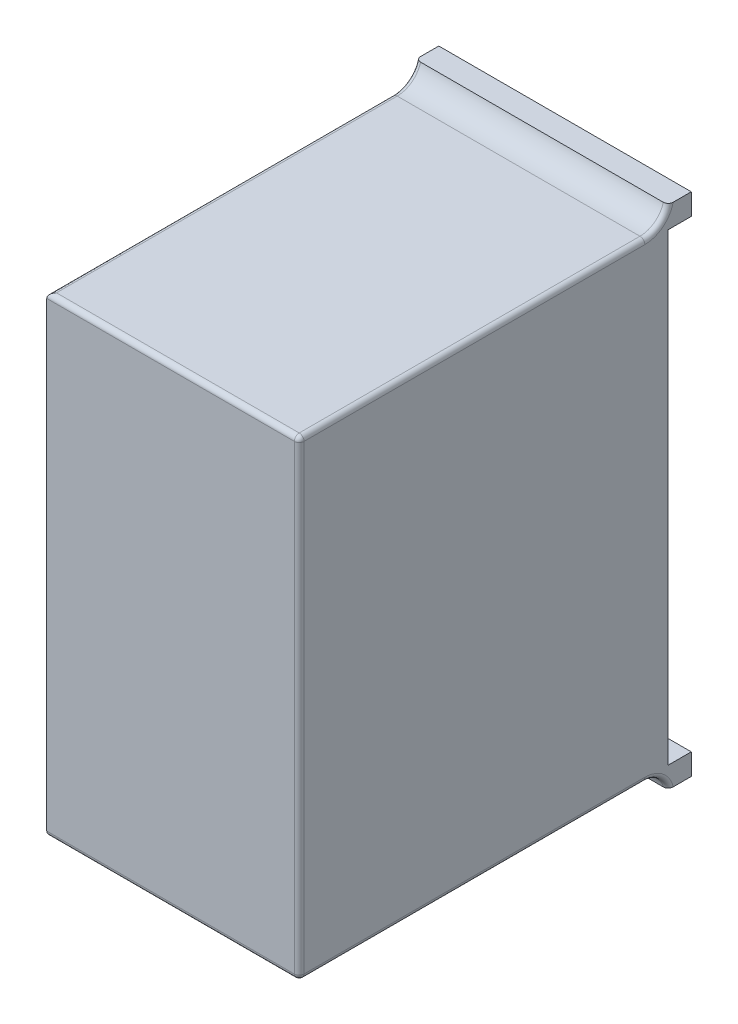
ISO-10303-21;
HEADER;
FILE_DESCRIPTION(('STEP AP214'),'2;1');
FILE_NAME('part.step','',(''),(''),'','','');
FILE_SCHEMA(('AUTOMOTIVE_DESIGN { 1 0 10303 214 1 1 1 1 }'));
ENDSEC;
DATA;
#1=APPLICATION_CONTEXT('core data for automotive mechanical design processes');
#2=APPLICATION_PROTOCOL_DEFINITION('international standard','automotive_design',2000,#1);
#3=PRODUCT_CONTEXT('',#1,'mechanical');
#4=PRODUCT('Part','Part','',(#3));
#5=PRODUCT_RELATED_PRODUCT_CATEGORY('part','',(#4));
#6=PRODUCT_DEFINITION_FORMATION('','',#4);
#7=PRODUCT_DEFINITION_CONTEXT('part definition',#1,'design');
#8=PRODUCT_DEFINITION('design','',#6,#7);
#9=PRODUCT_DEFINITION_SHAPE('','',#8);
#10=(LENGTH_UNIT() NAMED_UNIT(*) SI_UNIT(.MILLI.,.METRE.));
#11=(NAMED_UNIT(*) PLANE_ANGLE_UNIT() SI_UNIT($,.RADIAN.));
#12=(NAMED_UNIT(*) SI_UNIT($,.STERADIAN.) SOLID_ANGLE_UNIT());
#13=UNCERTAINTY_MEASURE_WITH_UNIT(LENGTH_MEASURE(1.E-05),#10,'distance_accuracy_value','');
#14=(GEOMETRIC_REPRESENTATION_CONTEXT(3) GLOBAL_UNCERTAINTY_ASSIGNED_CONTEXT((#13)) GLOBAL_UNIT_ASSIGNED_CONTEXT((#10,
#11,#12)) REPRESENTATION_CONTEXT('',''));
#15=CARTESIAN_POINT('',(0.,0.,0.));
#16=DIRECTION('',(0.,0.,1.));
#17=DIRECTION('',(1.,0.,0.));
#18=AXIS2_PLACEMENT_3D('',#15,#16,#17);
#19=CARTESIAN_POINT('',(0.,0.,0.));
#20=DIRECTION('',(1.,0.,0.));
#21=DIRECTION('',(0.,0.,-1.));
#22=AXIS2_PLACEMENT_3D('',#19,#20,#21);
#23=PLANE('',#22);
#24=DIRECTION('',(0.,0.,1.));
#25=VECTOR('',#24,1.);
#26=CARTESIAN_POINT('',(0.,-7.29999999999999,-161.5));
#27=LINE('',#26,#25);
#28=CARTESIAN_POINT('',(0.,-7.29999999999999,-161.5));
#29=VERTEX_POINT('',#28);
#30=CARTESIAN_POINT('',(0.,-7.29999999999999,-154.063701940291));
#31=VERTEX_POINT('',#30);
#32=EDGE_CURVE('E206',#29,#31,#27,.T.);
#33=ORIENTED_EDGE('',*,*,#32,.T.);
#34=CARTESIAN_POINT('',(0.,-9.99999999999998,-142.371396778348));
#35=DIRECTION('',(1.,0.,0.));
#36=DIRECTION('',(0.,0.,-1.));
#37=AXIS2_PLACEMENT_3D('',#34,#35,#36);
#38=CIRCLE('',#37,12.);
#39=CARTESIAN_POINT('',(0.,1.49999999999998,-145.799224078549));
#40=VERTEX_POINT('',#39);
#41=EDGE_CURVE('E517',#31,#40,#38,.T.);
#42=ORIENTED_EDGE('',*,*,#41,.T.);
#43=DIRECTION('',(0.,0.,1.));
#44=VECTOR('',#43,1.);
#45=CARTESIAN_POINT('',(0.,1.49999999999998,-152.));
#46=LINE('',#45,#44);
#47=CARTESIAN_POINT('',(0.,1.50000000000001,-161.5));
#48=VERTEX_POINT('',#47);
#49=EDGE_CURVE('E229',#48,#40,#46,.T.);
#50=ORIENTED_EDGE('',*,*,#49,.F.);
#51=DIRECTION('',(0.,1.,0.));
#52=VECTOR('',#51,1.);
#53=CARTESIAN_POINT('',(0.,1.50000000000001,-161.5));
#54=LINE('',#53,#52);
#55=EDGE_CURVE('E210',#29,#48,#54,.T.);
#56=ORIENTED_EDGE('',*,*,#55,.F.);
#57=EDGE_LOOP('',(#33,#42,#50,#56));
#58=FACE_BOUND('',#57,.T.);
#59=ADVANCED_FACE('F45',(#58),#23,.F.);
#60=DIRECTION('',(0.,0.,-1.));
#61=VECTOR('',#60,1.);
#62=CARTESIAN_POINT('',(0.,192.5,-1.5));
#63=LINE('',#62,#61);
#64=CARTESIAN_POINT('',(0.,192.5,-145.799224078549));
#65=VERTEX_POINT('',#64);
#66=CARTESIAN_POINT('',(0.,192.5,-161.5));
#67=VERTEX_POINT('',#66);
#68=EDGE_CURVE('E262',#65,#67,#63,.T.);
#69=ORIENTED_EDGE('',*,*,#68,.F.);
#70=CARTESIAN_POINT('',(0.,204.,-142.371396778348));
#71=DIRECTION('',(1.,0.,0.));
#72=DIRECTION('',(0.,0.,-1.));
#73=AXIS2_PLACEMENT_3D('',#70,#71,#72);
#74=CIRCLE('',#73,12.);
#75=CARTESIAN_POINT('',(0.,201.3,-154.063701940291));
#76=VERTEX_POINT('',#75);
#77=EDGE_CURVE('E417',#65,#76,#74,.T.);
#78=ORIENTED_EDGE('',*,*,#77,.T.);
#79=DIRECTION('',(0.,0.,1.));
#80=VECTOR('',#79,1.);
#81=CARTESIAN_POINT('',(0.,201.3,-161.5));
#82=LINE('',#81,#80);
#83=CARTESIAN_POINT('',(0.,201.3,-161.5));
#84=VERTEX_POINT('',#83);
#85=EDGE_CURVE('E235',#84,#76,#82,.T.);
#86=ORIENTED_EDGE('',*,*,#85,.F.);
#87=DIRECTION('',(0.,1.,0.));
#88=VECTOR('',#87,1.);
#89=CARTESIAN_POINT('',(0.,192.5,-161.5));
#90=LINE('',#89,#88);
#91=EDGE_CURVE('E249',#67,#84,#90,.T.);
#92=ORIENTED_EDGE('',*,*,#91,.F.);
#93=EDGE_LOOP('',(#69,#78,#86,#92));
#94=FACE_BOUND('',#93,.T.);
#95=ADVANCED_FACE('F448',(#94),#23,.F.);
#96=CARTESIAN_POINT('',(104.,0.,-152.));
#97=DIRECTION('',(0.,0.,1.));
#98=DIRECTION('',(1.,0.,0.));
#99=AXIS2_PLACEMENT_3D('',#96,#97,#98);
#100=PLANE('',#99);
#101=DIRECTION('',(1.,0.,0.));
#102=VECTOR('',#101,1.);
#103=CARTESIAN_POINT('',(104.,1.5,-152.));
#104=LINE('',#103,#102);
#105=CARTESIAN_POINT('',(102.5,1.50000000000002,-152.));
#106=VERTEX_POINT('',#105);
#107=CARTESIAN_POINT('',(104.,1.5,-152.));
#108=VERTEX_POINT('',#107);
#109=EDGE_CURVE('E284',#106,#108,#104,.T.);
#110=ORIENTED_EDGE('',*,*,#109,.F.);
#111=DIRECTION('',(0.,1.,0.));
#112=VECTOR('',#111,1.);
#113=CARTESIAN_POINT('',(102.5,0.,-152.));
#114=LINE('',#113,#112);
#115=CARTESIAN_POINT('',(102.5,192.5,-152.));
#116=VERTEX_POINT('',#115);
#117=EDGE_CURVE('E267',#106,#116,#114,.T.);
#118=ORIENTED_EDGE('',*,*,#117,.T.);
#119=DIRECTION('',(-1.,0.,0.));
#120=VECTOR('',#119,1.);
#121=CARTESIAN_POINT('',(0.,192.5,-152.));
#122=LINE('',#121,#120);
#123=CARTESIAN_POINT('',(104.,192.5,-152.));
#124=VERTEX_POINT('',#123);
#125=EDGE_CURVE('E245',#124,#116,#122,.T.);
#126=ORIENTED_EDGE('',*,*,#125,.F.);
#127=DIRECTION('',(0.,1.,0.));
#128=VECTOR('',#127,1.);
#129=CARTESIAN_POINT('',(104.,0.,-152.));
#130=LINE('',#129,#128);
#131=EDGE_CURVE('E281',#108,#124,#130,.T.);
#132=ORIENTED_EDGE('',*,*,#131,.F.);
#133=EDGE_LOOP('',(#110,#118,#126,#132));
#134=FACE_BOUND('',#133,.T.);
#135=ADVANCED_FACE('F456',(#134),#100,.F.);
#136=CARTESIAN_POINT('',(104.,0.,0.));
#137=DIRECTION('',(0.,1.,0.));
#138=DIRECTION('',(0.,0.,1.));
#139=AXIS2_PLACEMENT_3D('',#136,#137,#138);
#140=PLANE('',#139);
#141=DIRECTION('',(1.,0.,0.));
#142=VECTOR('',#141,1.);
#143=CARTESIAN_POINT('',(104.,0.,-142.371396778348));
#144=LINE('',#143,#142);
#145=CARTESIAN_POINT('',(2.,0.,-142.371396778348));
#146=VERTEX_POINT('',#145);
#147=CARTESIAN_POINT('',(102.,0.,-142.371396778348));
#148=VERTEX_POINT('',#147);
#149=EDGE_CURVE('E287',#146,#148,#144,.T.);
#150=ORIENTED_EDGE('',*,*,#149,.T.);
#151=DIRECTION('',(0.,0.,-1.));
#152=VECTOR('',#151,1.);
#153=CARTESIAN_POINT('',(102.,0.,0.));
#154=LINE('',#153,#152);
#155=CARTESIAN_POINT('',(102.,0.,-2.));
#156=VERTEX_POINT('',#155);
#157=EDGE_CURVE('E356',#148,#156,#154,.F.);
#158=ORIENTED_EDGE('',*,*,#157,.T.);
#159=DIRECTION('',(-1.,0.,0.));
#160=VECTOR('',#159,1.);
#161=CARTESIAN_POINT('',(104.,0.,-2.));
#162=LINE('',#161,#160);
#163=CARTESIAN_POINT('',(2.,0.,-2.));
#164=VERTEX_POINT('',#163);
#165=EDGE_CURVE('E354',#156,#164,#162,.T.);
#166=ORIENTED_EDGE('',*,*,#165,.T.);
#167=DIRECTION('',(0.,0.,-1.));
#168=VECTOR('',#167,1.);
#169=CARTESIAN_POINT('',(2.,0.,0.));
#170=LINE('',#169,#168);
#171=EDGE_CURVE('E352',#164,#146,#170,.T.);
#172=ORIENTED_EDGE('',*,*,#171,.T.);
#173=EDGE_LOOP('',(#150,#158,#166,#172));
#174=FACE_BOUND('',#173,.T.);
#175=ADVANCED_FACE('F455',(#174),#140,.F.);
#176=CARTESIAN_POINT('',(104.,194.,0.));
#177=DIRECTION('',(0.,-1.,0.));
#178=DIRECTION('',(0.,0.,-1.));
#179=AXIS2_PLACEMENT_3D('',#176,#177,#178);
#180=PLANE('',#179);
#181=DIRECTION('',(-1.,0.,0.));
#182=VECTOR('',#181,1.);
#183=CARTESIAN_POINT('',(104.,194.,-142.371396778348));
#184=LINE('',#183,#182);
#185=CARTESIAN_POINT('',(102.,194.,-142.371396778348));
#186=VERTEX_POINT('',#185);
#187=CARTESIAN_POINT('',(2.,194.,-142.371396778348));
#188=VERTEX_POINT('',#187);
#189=EDGE_CURVE('E290',#186,#188,#184,.T.);
#190=ORIENTED_EDGE('',*,*,#189,.T.);
#191=DIRECTION('',(0.,0.,1.));
#192=VECTOR('',#191,1.);
#193=CARTESIAN_POINT('',(2.,194.,0.));
#194=LINE('',#193,#192);
#195=CARTESIAN_POINT('',(2.,194.,-2.));
#196=VERTEX_POINT('',#195);
#197=EDGE_CURVE('E11',#188,#196,#194,.T.);
#198=ORIENTED_EDGE('',*,*,#197,.T.);
#199=DIRECTION('',(-1.,0.,0.));
#200=VECTOR('',#199,1.);
#201=CARTESIAN_POINT('',(104.,194.,-2.));
#202=LINE('',#201,#200);
#203=CARTESIAN_POINT('',(102.,194.,-2.));
#204=VERTEX_POINT('',#203);
#205=EDGE_CURVE('E55',#196,#204,#202,.F.);
#206=ORIENTED_EDGE('',*,*,#205,.T.);
#207=DIRECTION('',(0.,0.,1.));
#208=VECTOR('',#207,1.);
#209=CARTESIAN_POINT('',(102.,194.,-142.371396778348));
#210=LINE('',#209,#208);
#211=EDGE_CURVE('E368',#204,#186,#210,.F.);
#212=ORIENTED_EDGE('',*,*,#211,.T.);
#213=EDGE_LOOP('',(#190,#198,#206,#212));
#214=FACE_BOUND('',#213,.T.);
#215=ADVANCED_FACE('F451',(#214),#180,.F.);
#216=CARTESIAN_POINT('',(104.,0.,0.));
#217=DIRECTION('',(0.,0.,-1.));
#218=DIRECTION('',(-1.,0.,0.));
#219=AXIS2_PLACEMENT_3D('',#216,#217,#218);
#220=PLANE('',#219);
#221=DIRECTION('',(0.,-1.,0.));
#222=VECTOR('',#221,1.);
#223=CARTESIAN_POINT('',(0.,0.,0.));
#224=LINE('',#223,#222);
#225=CARTESIAN_POINT('',(0.,192.,0.));
#226=VERTEX_POINT('',#225);
#227=CARTESIAN_POINT('',(0.,2.,0.));
#228=VERTEX_POINT('',#227);
#229=EDGE_CURVE('E277',#226,#228,#224,.T.);
#230=ORIENTED_EDGE('',*,*,#229,.T.);
#231=DIRECTION('',(-1.,0.,0.));
#232=VECTOR('',#231,1.);
#233=CARTESIAN_POINT('',(104.,2.,0.));
#234=LINE('',#233,#232);
#235=CARTESIAN_POINT('',(102.,2.,0.));
#236=VERTEX_POINT('',#235);
#237=EDGE_CURVE('E362',#228,#236,#234,.F.);
#238=ORIENTED_EDGE('',*,*,#237,.T.);
#239=DIRECTION('',(0.,-1.,0.));
#240=VECTOR('',#239,1.);
#241=CARTESIAN_POINT('',(102.,194.,0.));
#242=LINE('',#241,#240);
#243=CARTESIAN_POINT('',(102.,192.,0.));
#244=VERTEX_POINT('',#243);
#245=EDGE_CURVE('E360',#236,#244,#242,.F.);
#246=ORIENTED_EDGE('',*,*,#245,.T.);
#247=DIRECTION('',(-1.,0.,0.));
#248=VECTOR('',#247,1.);
#249=CARTESIAN_POINT('',(104.,192.,0.));
#250=LINE('',#249,#248);
#251=EDGE_CURVE('E358',#244,#226,#250,.T.);
#252=ORIENTED_EDGE('',*,*,#251,.T.);
#253=EDGE_LOOP('',(#230,#238,#246,#252));
#254=FACE_BOUND('',#253,.T.);
#255=ADVANCED_FACE('F444',(#254),#220,.F.);
#256=CARTESIAN_POINT('',(104.,0.,0.));
#257=DIRECTION('',(1.,0.,0.));
#258=DIRECTION('',(0.,0.,-1.));
#259=AXIS2_PLACEMENT_3D('',#256,#257,#258);
#260=PLANE('',#259);
#261=DIRECTION('',(0.,0.,-1.));
#262=VECTOR('',#261,1.);
#263=CARTESIAN_POINT('',(104.,2.00000000000002,-142.371396778348));
#264=LINE('',#263,#262);
#265=CARTESIAN_POINT('',(104.,2.,-2.));
#266=VERTEX_POINT('',#265);
#267=CARTESIAN_POINT('',(104.,2.00000000000002,-142.371396778348));
#268=VERTEX_POINT('',#267);
#269=EDGE_CURVE('E296',#266,#268,#264,.T.);
#270=ORIENTED_EDGE('',*,*,#269,.T.);
#271=CARTESIAN_POINT('',(104.,-9.99999999999999,-142.371396778348));
#272=DIRECTION('',(1.,0.,0.));
#273=DIRECTION('',(0.,0.,-1.));
#274=AXIS2_PLACEMENT_3D('',#271,#272,#273);
#275=CIRCLE('',#274,12.);
#276=CARTESIAN_POINT('',(104.,-7.3,-154.063701940291));
#277=VERTEX_POINT('',#276);
#278=EDGE_CURVE('E225',#268,#277,#275,.F.);
#279=ORIENTED_EDGE('',*,*,#278,.T.);
#280=DIRECTION('',(0.,0.,1.));
#281=VECTOR('',#280,1.);
#282=CARTESIAN_POINT('',(104.,-7.3,-161.5));
#283=LINE('',#282,#281);
#284=CARTESIAN_POINT('',(104.,-7.3,-161.5));
#285=VERTEX_POINT('',#284);
#286=EDGE_CURVE('E204',#285,#277,#283,.T.);
#287=ORIENTED_EDGE('',*,*,#286,.F.);
#288=DIRECTION('',(0.,-1.,0.));
#289=VECTOR('',#288,1.);
#290=CARTESIAN_POINT('',(104.,1.5,-161.5));
#291=LINE('',#290,#289);
#292=CARTESIAN_POINT('',(104.,1.5,-161.5));
#293=VERTEX_POINT('',#292);
#294=EDGE_CURVE('E211',#293,#285,#291,.T.);
#295=ORIENTED_EDGE('',*,*,#294,.F.);
#296=DIRECTION('',(0.,0.,1.));
#297=VECTOR('',#296,1.);
#298=CARTESIAN_POINT('',(104.,1.5,-161.5));
#299=LINE('',#298,#297);
#300=EDGE_CURVE('E231',#293,#108,#299,.T.);
#301=ORIENTED_EDGE('',*,*,#300,.T.);
#302=ORIENTED_EDGE('',*,*,#131,.T.);
#303=DIRECTION('',(0.,0.,1.));
#304=VECTOR('',#303,1.);
#305=CARTESIAN_POINT('',(104.,192.5,-161.5));
#306=LINE('',#305,#304);
#307=CARTESIAN_POINT('',(104.,192.5,-161.5));
#308=VERTEX_POINT('',#307);
#309=EDGE_CURVE('E241',#308,#124,#306,.T.);
#310=ORIENTED_EDGE('',*,*,#309,.F.);
#311=DIRECTION('',(0.,-1.,0.));
#312=VECTOR('',#311,1.);
#313=CARTESIAN_POINT('',(104.,192.5,-161.5));
#314=LINE('',#313,#312);
#315=CARTESIAN_POINT('',(104.,201.3,-161.5));
#316=VERTEX_POINT('',#315);
#317=EDGE_CURVE('E254',#316,#308,#314,.T.);
#318=ORIENTED_EDGE('',*,*,#317,.F.);
#319=DIRECTION('',(0.,0.,1.));
#320=VECTOR('',#319,1.);
#321=CARTESIAN_POINT('',(104.,201.3,-161.5));
#322=LINE('',#321,#320);
#323=CARTESIAN_POINT('',(104.,201.3,-154.063701940291));
#324=VERTEX_POINT('',#323);
#325=EDGE_CURVE('E238',#316,#324,#322,.T.);
#326=ORIENTED_EDGE('',*,*,#325,.T.);
#327=CARTESIAN_POINT('',(104.,204.,-142.371396778348));
#328=DIRECTION('',(1.,0.,0.));
#329=DIRECTION('',(0.,0.,-1.));
#330=AXIS2_PLACEMENT_3D('',#327,#328,#329);
#331=CIRCLE('',#330,12.);
#332=CARTESIAN_POINT('',(104.,192.,-142.371396778348));
#333=VERTEX_POINT('',#332);
#334=EDGE_CURVE('E298',#324,#333,#331,.F.);
#335=ORIENTED_EDGE('',*,*,#334,.T.);
#336=DIRECTION('',(0.,0.,1.));
#337=VECTOR('',#336,1.);
#338=CARTESIAN_POINT('',(104.,192.,0.));
#339=LINE('',#338,#337);
#340=CARTESIAN_POINT('',(104.,192.,-2.));
#341=VERTEX_POINT('',#340);
#342=EDGE_CURVE('E292',#333,#341,#339,.T.);
#343=ORIENTED_EDGE('',*,*,#342,.T.);
#344=DIRECTION('',(0.,-1.,0.));
#345=VECTOR('',#344,1.);
#346=CARTESIAN_POINT('',(104.,0.,-2.));
#347=LINE('',#346,#345);
#348=EDGE_CURVE('E294',#341,#266,#347,.T.);
#349=ORIENTED_EDGE('',*,*,#348,.T.);
#350=EDGE_LOOP('',(#270,#279,#287,#295,#301,#302,#310,#318,#326,#335,#343,#349));
#351=FACE_BOUND('',#350,.T.);
#352=ADVANCED_FACE('F223',(#351),#260,.T.);
#353=DIRECTION('',(0.,-1.,0.));
#354=VECTOR('',#353,1.);
#355=CARTESIAN_POINT('',(0.,192.5,-1.5));
#356=LINE('',#355,#354);
#357=CARTESIAN_POINT('',(0.,192.,-1.5));
#358=VERTEX_POINT('',#357);
#359=CARTESIAN_POINT('',(0.,2.,-1.5));
#360=VERTEX_POINT('',#359);
#361=EDGE_CURVE('E226',#358,#360,#356,.T.);
#362=ORIENTED_EDGE('',*,*,#361,.T.);
#363=DIRECTION('',(0.,0.,-1.));
#364=VECTOR('',#363,1.);
#365=CARTESIAN_POINT('',(0.,2.,0.));
#366=LINE('',#365,#364);
#367=EDGE_CURVE('E525',#360,#228,#366,.F.);
#368=ORIENTED_EDGE('',*,*,#367,.T.);
#369=ORIENTED_EDGE('',*,*,#229,.F.);
#370=DIRECTION('',(0.,0.,1.));
#371=VECTOR('',#370,1.);
#372=CARTESIAN_POINT('',(0.,192.,0.));
#373=LINE('',#372,#371);
#374=EDGE_CURVE('E543',#226,#358,#373,.F.);
#375=ORIENTED_EDGE('',*,*,#374,.T.);
#376=EDGE_LOOP('',(#362,#368,#369,#375));
#377=FACE_BOUND('',#376,.T.);
#378=ADVANCED_FACE('F443',(#377),#23,.F.);
#379=CARTESIAN_POINT('',(104.,1.5,0.));
#380=DIRECTION('',(0.,1.,0.));
#381=DIRECTION('',(0.,0.,1.));
#382=AXIS2_PLACEMENT_3D('',#379,#380,#381);
#383=PLANE('',#382);
#384=ORIENTED_EDGE('',*,*,#49,.T.);
#385=CARTESIAN_POINT('',(0.,1.50000000000002,-145.799224078549));
#386=CARTESIAN_POINT('',(2.69196557595979E-05,1.50000000000002,-145.632511004218));
#387=CARTESIAN_POINT('',(0.00170136117057736,1.50000000000002,-145.465816021866));
#388=CARTESIAN_POINT('',(0.00717529070023196,1.50000000000002,-145.132474692508));
#389=CARTESIAN_POINT('',(0.01097457189588,1.50000000000002,-144.965828342348));
#390=CARTESIAN_POINT('',(0.0195281880106672,1.50000000000002,-144.632582052626));
#391=CARTESIAN_POINT('',(0.0242824210350084,1.50000000000002,-144.46598211001));
#392=CARTESIAN_POINT('',(0.0337710533514081,1.50000000000002,-144.132777112914));
#393=CARTESIAN_POINT('',(0.0385054521747748,1.50000000000002,-143.966172058407));
#394=CARTESIAN_POINT('',(0.0471441613034231,1.50000000000002,-143.632903805369));
#395=CARTESIAN_POINT('',(0.0510482944028582,1.50000000000002,-143.466240602014));
#396=CARTESIAN_POINT('',(0.0574239269692432,1.50000000000002,-143.132888931277));
#397=CARTESIAN_POINT('',(0.0598954565262315,1.50000000000002,-142.966200464498));
#398=CARTESIAN_POINT('',(0.0630426938938279,1.50000000000002,-142.632799103484));
#399=CARTESIAN_POINT('',(0.0637183338283798,1.50000000000002,-142.466086208564));
#400=CARTESIAN_POINT('',(0.0633159908884878,1.50000000000002,-142.216014471722));
#401=CARTESIAN_POINT('',(0.0629458720826526,1.50000000000002,-142.132653938899));
#402=CARTESIAN_POINT('',(0.0617530423723774,1.50000000000002,-141.965936077929));
#403=CARTESIAN_POINT('',(0.0609303313812017,1.50000000000002,-141.882578749782));
#404=CARTESIAN_POINT('',(0.059891026621272,1.50000000000002,-141.799224078549));
#405=B_SPLINE_CURVE_WITH_KNOTS('',3,(#385,#386,#387,#388,#389,#390,#391,#392,#393,#394,#395,
#396,#397,#398,#399,#400,#401,#402,#403,#404),.UNSPECIFIED.,.F.,.F.,(4,2,2,2,2,2,2,2,2,4),(0.,
0.500106527819296,1.00016438672912,1.50016891702935,2.00018519677633,2.50030808947395,
3.00042047733759,3.50055176679382,3.75063474076187,4.00071776265634),.UNSPECIFIED.);
#406=CARTESIAN_POINT('',(0.0635083268962936,1.50000000000002,-142.371396778348));
#407=VERTEX_POINT('',#406);
#408=EDGE_CURVE('E420',#40,#407,#405,.T.);
#409=ORIENTED_EDGE('',*,*,#408,.T.);
#410=DIRECTION('',(0.,0.,-1.));
#411=VECTOR('',#410,1.);
#412=CARTESIAN_POINT('',(0.0635083268962936,1.5,0.));
#413=LINE('',#412,#411);
#414=CARTESIAN_POINT('',(0.0635083268962933,1.5,-1.5));
#415=VERTEX_POINT('',#414);
#416=EDGE_CURVE('E522',#407,#415,#413,.F.);
#417=ORIENTED_EDGE('',*,*,#416,.T.);
#418=DIRECTION('',(-1.,0.,0.));
#419=VECTOR('',#418,1.);
#420=CARTESIAN_POINT('',(104.,1.5,-1.5));
#421=LINE('',#420,#419);
#422=CARTESIAN_POINT('',(102.5,1.5,-1.5));
#423=VERTEX_POINT('',#422);
#424=EDGE_CURVE('E268',#423,#415,#421,.T.);
#425=ORIENTED_EDGE('',*,*,#424,.F.);
#426=DIRECTION('',(0.,0.,-1.));
#427=VECTOR('',#426,1.);
#428=CARTESIAN_POINT('',(102.5,1.5,0.));
#429=LINE('',#428,#427);
#430=EDGE_CURVE('E264',#423,#106,#429,.T.);
#431=ORIENTED_EDGE('',*,*,#430,.T.);
#432=ORIENTED_EDGE('',*,*,#109,.T.);
#433=ORIENTED_EDGE('',*,*,#300,.F.);
#434=DIRECTION('',(1.,0.,0.));
#435=VECTOR('',#434,1.);
#436=CARTESIAN_POINT('',(104.,1.5,-161.5));
#437=LINE('',#436,#435);
#438=EDGE_CURVE('E216',#48,#293,#437,.T.);
#439=ORIENTED_EDGE('',*,*,#438,.F.);
#440=EDGE_LOOP('',(#384,#409,#417,#425,#431,#432,#433,#439));
#441=FACE_BOUND('',#440,.T.);
#442=ADVANCED_FACE('F433',(#441),#383,.T.);
#443=CARTESIAN_POINT('',(104.,192.5,0.));
#444=DIRECTION('',(0.,-1.,0.));
#445=DIRECTION('',(0.,0.,-1.));
#446=AXIS2_PLACEMENT_3D('',#443,#444,#445);
#447=PLANE('',#446);
#448=DIRECTION('',(0.,0.,1.));
#449=VECTOR('',#448,1.);
#450=CARTESIAN_POINT('',(0.0635083268962938,192.5,0.));
#451=LINE('',#450,#449);
#452=CARTESIAN_POINT('',(0.0635083268962916,192.5,-1.5));
#453=VERTEX_POINT('',#452);
#454=CARTESIAN_POINT('',(0.0635083268962938,192.5,-142.371396778348));
#455=VERTEX_POINT('',#454);
#456=EDGE_CURVE('E410',#453,#455,#451,.F.);
#457=ORIENTED_EDGE('',*,*,#456,.T.);
#458=CARTESIAN_POINT('',(0.0635083268962888,192.5,-142.371396778348));
#459=CARTESIAN_POINT('',(0.0635553732142154,192.5,-142.538094087619));
#460=CARTESIAN_POINT('',(0.0625737404875256,192.5,-142.704787846968));
#461=CARTESIAN_POINT('',(0.0588960050049496,192.5,-143.038139324312));
#462=CARTESIAN_POINT('',(0.0562000844339027,192.5,-143.204797044254));
#463=CARTESIAN_POINT('',(0.0494366571152717,192.5,-143.538076453718));
#464=CARTESIAN_POINT('',(0.0453692036877792,192.5,-143.704698144388));
#465=CARTESIAN_POINT('',(0.0365111118425034,192.5,-144.037929311299));
#466=CARTESIAN_POINT('',(0.0317204381493339,192.5,-144.204538786546));
#467=CARTESIAN_POINT('',(0.0222462823602316,192.5,-144.537790240317));
#468=CARTESIAN_POINT('',(0.0175628190433473,192.5,-144.704432219456));
#469=CARTESIAN_POINT('',(0.00931540111614282,192.5,-145.037732098291));
#470=CARTESIAN_POINT('',(0.00575135888123907,192.5,-145.204389995718));
#471=CARTESIAN_POINT('',(0.000891566623748423,192.5,-145.53776391697));
#472=CARTESIAN_POINT('',(-0.00040397426046415,192.5,-145.704479944736));
#473=CARTESIAN_POINT('',(0.000619495680994599,192.5,-146.037942034435));
#474=CARTESIAN_POINT('',(0.00293950380759096,192.5,-146.204688091964));
#475=CARTESIAN_POINT('',(0.00774100949146482,192.5,-146.371396778348));
#476=B_SPLINE_CURVE_WITH_KNOTS('',3,(#458,#459,#460,#461,#462,#463,#464,#465,#466,#467,#468,
#469,#470,#471,#472,#473,#474,#475),.UNSPECIFIED.,.F.,.F.,(4,2,2,2,2,2,2,2,4),(0.,
0.500083354327208,1.0001135714974,1.50012435159497,2.00015952782232,2.5002816305577,
3.00036457562529,3.50049362206666,4.00076064684789),.UNSPECIFIED.);
#477=EDGE_CURVE('E416',#455,#65,#476,.T.);
#478=ORIENTED_EDGE('',*,*,#477,.T.);
#479=ORIENTED_EDGE('',*,*,#68,.T.);
#480=DIRECTION('',(-1.,0.,0.));
#481=VECTOR('',#480,1.);
#482=CARTESIAN_POINT('',(0.,192.5,-161.5));
#483=LINE('',#482,#481);
#484=EDGE_CURVE('E244',#308,#67,#483,.T.);
#485=ORIENTED_EDGE('',*,*,#484,.F.);
#486=ORIENTED_EDGE('',*,*,#309,.T.);
#487=ORIENTED_EDGE('',*,*,#125,.T.);
#488=DIRECTION('',(0.,0.,1.));
#489=VECTOR('',#488,1.);
#490=CARTESIAN_POINT('',(102.5,192.5,0.));
#491=LINE('',#490,#489);
#492=CARTESIAN_POINT('',(102.5,192.5,-1.5));
#493=VERTEX_POINT('',#492);
#494=EDGE_CURVE('E274',#116,#493,#491,.T.);
#495=ORIENTED_EDGE('',*,*,#494,.T.);
#496=DIRECTION('',(-1.,0.,0.));
#497=VECTOR('',#496,1.);
#498=CARTESIAN_POINT('',(104.,192.5,-1.5));
#499=LINE('',#498,#497);
#500=EDGE_CURVE('E271',#493,#453,#499,.T.);
#501=ORIENTED_EDGE('',*,*,#500,.T.);
#502=EDGE_LOOP('',(#457,#478,#479,#485,#486,#487,#495,#501));
#503=FACE_BOUND('',#502,.T.);
#504=ADVANCED_FACE('F428',(#503),#447,.T.);
#505=CARTESIAN_POINT('',(104.,0.,-1.5));
#506=DIRECTION('',(0.,0.,-1.));
#507=DIRECTION('',(-1.,0.,0.));
#508=AXIS2_PLACEMENT_3D('',#505,#506,#507);
#509=PLANE('',#508);
#510=ORIENTED_EDGE('',*,*,#424,.T.);
#511=CARTESIAN_POINT('',(2.,2.,-1.5));
#512=DIRECTION('',(0.,0.,-1.));
#513=DIRECTION('',(-1.,0.,0.));
#514=AXIS2_PLACEMENT_3D('',#511,#512,#513);
#515=CIRCLE('',#514,2.);
#516=EDGE_CURVE('E366',#415,#360,#515,.T.);
#517=ORIENTED_EDGE('',*,*,#516,.T.);
#518=ORIENTED_EDGE('',*,*,#361,.F.);
#519=CARTESIAN_POINT('',(2.,192.,-1.5));
#520=DIRECTION('',(0.,0.,-1.));
#521=DIRECTION('',(-1.,0.,0.));
#522=AXIS2_PLACEMENT_3D('',#519,#520,#521);
#523=CIRCLE('',#522,2.);
#524=EDGE_CURVE('E364',#358,#453,#523,.T.);
#525=ORIENTED_EDGE('',*,*,#524,.T.);
#526=ORIENTED_EDGE('',*,*,#500,.F.);
#527=DIRECTION('',(0.,-1.,0.));
#528=VECTOR('',#527,1.);
#529=CARTESIAN_POINT('',(102.5,0.,-1.5));
#530=LINE('',#529,#528);
#531=EDGE_CURVE('E272',#493,#423,#530,.T.);
#532=ORIENTED_EDGE('',*,*,#531,.T.);
#533=EDGE_LOOP('',(#510,#517,#518,#525,#526,#532));
#534=FACE_BOUND('',#533,.T.);
#535=ADVANCED_FACE('F432',(#534),#509,.T.);
#536=CARTESIAN_POINT('',(102.5,0.,0.));
#537=DIRECTION('',(1.,0.,0.));
#538=DIRECTION('',(0.,0.,-1.));
#539=AXIS2_PLACEMENT_3D('',#536,#537,#538);
#540=PLANE('',#539);
#541=ORIENTED_EDGE('',*,*,#430,.F.);
#542=ORIENTED_EDGE('',*,*,#531,.F.);
#543=ORIENTED_EDGE('',*,*,#494,.F.);
#544=ORIENTED_EDGE('',*,*,#117,.F.);
#545=EDGE_LOOP('',(#541,#542,#543,#544));
#546=FACE_BOUND('',#545,.T.);
#547=ADVANCED_FACE('F330',(#546),#540,.F.);
#548=CARTESIAN_POINT('',(0.,201.3,-161.5));
#549=DIRECTION('',(0.,-1.,0.));
#550=DIRECTION('',(0.,0.,-1.));
#551=AXIS2_PLACEMENT_3D('',#548,#549,#550);
#552=PLANE('',#551);
#553=ORIENTED_EDGE('',*,*,#85,.T.);
#554=CARTESIAN_POINT('',(0.,201.3,-154.063701940291));
#555=CARTESIAN_POINT('',(1.11902517823443E-06,201.3,-154.004442905563));
#556=CARTESIAN_POINT('',(0.00250183234931162,201.3,-153.945212832386));
#557=CARTESIAN_POINT('',(0.0124715391607993,201.3,-153.827174616716));
#558=CARTESIAN_POINT('',(0.0199403401494625,201.3,-153.768366457964));
#559=CARTESIAN_POINT('',(0.0497313139473504,201.3,-153.593240269779));
#560=CARTESIAN_POINT('',(0.0794382048310986,201.3,-153.478090797808));
#561=CARTESIAN_POINT('',(0.157764150767018,201.3,-153.254405705909));
#562=CARTESIAN_POINT('',(0.206393222657763,201.3,-153.145873624288));
#563=CARTESIAN_POINT('',(0.321312452709275,201.3,-152.938605573222));
#564=CARTESIAN_POINT('',(0.387597758943651,201.3,-152.839866922762));
#565=CARTESIAN_POINT('',(0.535520396391735,201.3,-152.655949641572));
#566=CARTESIAN_POINT('',(0.617029926105599,201.3,-152.570668307885));
#567=CARTESIAN_POINT('',(0.793605126150239,201.3,-152.415463124491));
#568=CARTESIAN_POINT('',(0.888672115223417,201.3,-152.345540770443));
#569=CARTESIAN_POINT('',(1.08679758348643,201.3,-152.22525631119));
#570=CARTESIAN_POINT('',(1.18955545276339,201.3,-152.174398622852));
#571=CARTESIAN_POINT('',(1.40231625831917,201.3,-152.091393942028));
#572=CARTESIAN_POINT('',(1.5123108750009,201.3,-152.059225867765));
#573=CARTESIAN_POINT('',(1.6860699211763,201.3,-152.024698537906));
#574=CARTESIAN_POINT('',(1.74853841756046,201.3,-152.015442559346));
#575=CARTESIAN_POINT('',(1.87399384049222,201.3,-152.003095372529));
#576=CARTESIAN_POINT('',(1.93697992689272,201.3,-151.99999562347));
#577=CARTESIAN_POINT('',(2.,201.3,-152.));
#578=B_SPLINE_CURVE_WITH_KNOTS('',3,(#554,#555,#556,#557,#558,#559,#560,#561,#562,#563,#564,
#565,#566,#567,#568,#569,#570,#571,#572,#573,#574,#575,#576,#577),.UNSPECIFIED.,.F.,.F.,(4,2,2,
2,2,2,2,2,2,2,2,4),(0.,0.177667173330099,0.355327462984112,0.710263776440678,1.06538823878264,
1.42041521355699,1.77258590248112,2.12479087065933,2.46707292319268,2.80896813017959,
2.99814838024775,3.18706598859248),.UNSPECIFIED.);
#579=CARTESIAN_POINT('',(2.,201.3,-152.));
#580=VERTEX_POINT('',#579);
#581=EDGE_CURVE('E342',#76,#580,#578,.T.);
#582=ORIENTED_EDGE('',*,*,#581,.T.);
#583=DIRECTION('',(1.,0.,0.));
#584=VECTOR('',#583,1.);
#585=CARTESIAN_POINT('',(0.,201.3,-152.));
#586=LINE('',#585,#584);
#587=CARTESIAN_POINT('',(102.,201.3,-152.));
#588=VERTEX_POINT('',#587);
#589=EDGE_CURVE('E248',#580,#588,#586,.T.);
#590=ORIENTED_EDGE('',*,*,#589,.T.);
#591=CARTESIAN_POINT('',(102.,201.3,-152.));
#592=CARTESIAN_POINT('',(102.054844076771,201.3,-151.99999903573));
#593=CARTESIAN_POINT('',(102.109661224073,201.3,-152.002344489042));
#594=CARTESIAN_POINT('',(102.218889525205,201.3,-152.011692516815));
#595=CARTESIAN_POINT('',(102.27330073338,201.3,-152.018694456145));
#596=CARTESIAN_POINT('',(102.435120266052,201.3,-152.046580780002));
#597=CARTESIAN_POINT('',(102.541422345015,201.3,-152.07434612843));
#598=CARTESIAN_POINT('',(102.747817248437,201.3,-152.147258807551));
#599=CARTESIAN_POINT('',(102.847909755642,201.3,-152.1924070255));
#600=CARTESIAN_POINT('',(103.03930145847,201.3,-152.298582581545));
#601=CARTESIAN_POINT('',(103.130599186102,201.3,-152.359612564289));
#602=CARTESIAN_POINT('',(103.303610664466,201.3,-152.49685739401));
#603=CARTESIAN_POINT('',(103.38512567221,201.3,-152.573322404891));
#604=CARTESIAN_POINT('',(103.534690707555,201.3,-152.738462545887));
#605=CARTESIAN_POINT('',(103.602737124873,201.3,-152.827140939051));
#606=CARTESIAN_POINT('',(103.725826395905,201.3,-153.017410502379));
#607=CARTESIAN_POINT('',(103.780349287601,201.3,-153.119337874066));
#608=CARTESIAN_POINT('',(103.871962471216,201.3,-153.330732857287));
#609=CARTESIAN_POINT('',(103.909057201459,201.3,-153.440198540934));
#610=CARTESIAN_POINT('',(103.957894256357,201.3,-153.63555993331));
#611=CARTESIAN_POINT('',(103.973663492316,201.3,-153.720473100052));
#612=CARTESIAN_POINT('',(103.994717739469,201.3,-153.891481226409));
#613=CARTESIAN_POINT('',(104.000015790095,201.3,-153.977574581607));
#614=CARTESIAN_POINT('',(104.,201.3,-154.063701940291));
#615=B_SPLINE_CURVE_WITH_KNOTS('',3,(#591,#592,#593,#594,#595,#596,#597,#598,#599,#600,#601,
#602,#603,#604,#605,#606,#607,#608,#609,#610,#611,#612,#613,#614),.UNSPECIFIED.,.F.,.F.,(4,2,2,
2,2,2,2,2,2,2,2,4),(0.,0.164428969884773,0.328835516752216,0.656737071410244,0.98465536504655,
1.31262829896133,1.64641924633656,1.98029954627073,2.32551622971095,2.67064495118433,
2.92912263442715,3.18727824040606),.UNSPECIFIED.);
#616=EDGE_CURVE('E335',#588,#324,#615,.T.);
#617=ORIENTED_EDGE('',*,*,#616,.T.);
#618=ORIENTED_EDGE('',*,*,#325,.F.);
#619=DIRECTION('',(1.,0.,0.));
#620=VECTOR('',#619,1.);
#621=CARTESIAN_POINT('',(0.,201.3,-161.5));
#622=LINE('',#621,#620);
#623=EDGE_CURVE('E256',#84,#316,#622,.T.);
#624=ORIENTED_EDGE('',*,*,#623,.F.);
#625=EDGE_LOOP('',(#553,#582,#590,#617,#618,#624));
#626=FACE_BOUND('',#625,.T.);
#627=ADVANCED_FACE('F325',(#626),#552,.F.);
#628=CARTESIAN_POINT('',(0.,0.,-161.5));
#629=DIRECTION('',(0.,0.,-1.));
#630=DIRECTION('',(-1.,0.,0.));
#631=AXIS2_PLACEMENT_3D('',#628,#629,#630);
#632=PLANE('',#631);
#633=ORIENTED_EDGE('',*,*,#91,.T.);
#634=ORIENTED_EDGE('',*,*,#623,.T.);
#635=ORIENTED_EDGE('',*,*,#317,.T.);
#636=ORIENTED_EDGE('',*,*,#484,.T.);
#637=EDGE_LOOP('',(#633,#634,#635,#636));
#638=FACE_BOUND('',#637,.T.);
#639=ADVANCED_FACE('F324',(#638),#632,.T.);
#640=CARTESIAN_POINT('',(104.,-7.3,-161.5));
#641=DIRECTION('',(0.,1.,0.));
#642=DIRECTION('',(-1.,0.,0.));
#643=AXIS2_PLACEMENT_3D('',#640,#641,#642);
#644=PLANE('',#643);
#645=ORIENTED_EDGE('',*,*,#286,.T.);
#646=CARTESIAN_POINT('',(104.,-7.3,-154.063701940291));
#647=CARTESIAN_POINT('',(103.999998880975,-7.3,-154.004442905563));
#648=CARTESIAN_POINT('',(103.997498167651,-7.3,-153.945212832386));
#649=CARTESIAN_POINT('',(103.987528460839,-7.3,-153.827174616716));
#650=CARTESIAN_POINT('',(103.980059659851,-7.3,-153.768366457964));
#651=CARTESIAN_POINT('',(103.950268686053,-7.3,-153.593240269779));
#652=CARTESIAN_POINT('',(103.920561795169,-7.3,-153.478090797808));
#653=CARTESIAN_POINT('',(103.842235849233,-7.3,-153.254405705909));
#654=CARTESIAN_POINT('',(103.793606777342,-7.3,-153.145873624288));
#655=CARTESIAN_POINT('',(103.678687547291,-7.3,-152.938605573222));
#656=CARTESIAN_POINT('',(103.612402241056,-7.3,-152.839866922762));
#657=CARTESIAN_POINT('',(103.464479603608,-7.3,-152.655949641572));
#658=CARTESIAN_POINT('',(103.382970073894,-7.3,-152.570668307885));
#659=CARTESIAN_POINT('',(103.20639487385,-7.3,-152.415463124491));
#660=CARTESIAN_POINT('',(103.111327884777,-7.3,-152.345540770443));
#661=CARTESIAN_POINT('',(102.913202416514,-7.3,-152.22525631119));
#662=CARTESIAN_POINT('',(102.810444547237,-7.3,-152.174398622852));
#663=CARTESIAN_POINT('',(102.597683741681,-7.3,-152.091393942028));
#664=CARTESIAN_POINT('',(102.487689124999,-7.3,-152.059225867765));
#665=CARTESIAN_POINT('',(102.313930078824,-7.3,-152.024698537906));
#666=CARTESIAN_POINT('',(102.25146158244,-7.3,-152.015442559346));
#667=CARTESIAN_POINT('',(102.126006159508,-7.3,-152.003095372529));
#668=CARTESIAN_POINT('',(102.063020073107,-7.3,-151.99999562347));
#669=CARTESIAN_POINT('',(102.,-7.3,-152.));
#670=B_SPLINE_CURVE_WITH_KNOTS('',3,(#646,#647,#648,#649,#650,#651,#652,#653,#654,#655,#656,
#657,#658,#659,#660,#661,#662,#663,#664,#665,#666,#667,#668,#669),.UNSPECIFIED.,.F.,.F.,(4,2,2,
2,2,2,2,2,2,2,2,4),(0.,0.177667173330099,0.355327462984112,0.710263776440675,1.06538823878264,
1.42041521355699,1.77258590248112,2.12479087065935,2.46707292319269,2.80896813017961,
2.99814838024777,3.1870659885925),.UNSPECIFIED.);
#671=CARTESIAN_POINT('',(102.,-7.3,-152.));
#672=VERTEX_POINT('',#671);
#673=EDGE_CURVE('E309',#277,#672,#670,.T.);
#674=ORIENTED_EDGE('',*,*,#673,.T.);
#675=DIRECTION('',(-1.,0.,0.));
#676=VECTOR('',#675,1.);
#677=CARTESIAN_POINT('',(104.,-7.3,-152.));
#678=LINE('',#677,#676);
#679=CARTESIAN_POINT('',(2.00000000000003,-7.29999999999999,-152.));
#680=VERTEX_POINT('',#679);
#681=EDGE_CURVE('E220',#672,#680,#678,.T.);
#682=ORIENTED_EDGE('',*,*,#681,.T.);
#683=CARTESIAN_POINT('',(2.,-7.29999999999999,-152.));
#684=CARTESIAN_POINT('',(1.94515592322911,-7.29999999999999,-151.99999903573));
#685=CARTESIAN_POINT('',(1.89033877592725,-7.29999999999999,-152.002344489042));
#686=CARTESIAN_POINT('',(1.78111047479546,-7.29999999999999,-152.011692516815));
#687=CARTESIAN_POINT('',(1.72669926662001,-7.29999999999999,-152.018694456145));
#688=CARTESIAN_POINT('',(1.56487973394792,-7.29999999999999,-152.046580780002));
#689=CARTESIAN_POINT('',(1.4585776549846,-7.29999999999999,-152.07434612843));
#690=CARTESIAN_POINT('',(1.25218275156341,-7.29999999999999,-152.147258807551));
#691=CARTESIAN_POINT('',(1.15209024435751,-7.29999999999999,-152.1924070255));
#692=CARTESIAN_POINT('',(0.960698541530376,-7.29999999999999,-152.298582581545));
#693=CARTESIAN_POINT('',(0.869400813897667,-7.29999999999999,-152.359612564289));
#694=CARTESIAN_POINT('',(0.696389335533877,-7.29999999999999,-152.49685739401));
#695=CARTESIAN_POINT('',(0.614874327790443,-7.29999999999999,-152.573322404891));
#696=CARTESIAN_POINT('',(0.465309292444964,-7.29999999999999,-152.738462545887));
#697=CARTESIAN_POINT('',(0.397262875127087,-7.29999999999999,-152.827140939051));
#698=CARTESIAN_POINT('',(0.274173604095335,-7.29999999999999,-153.017410502379));
#699=CARTESIAN_POINT('',(0.219650712398944,-7.29999999999999,-153.119337874066));
#700=CARTESIAN_POINT('',(0.128037528784386,-7.29999999999999,-153.330732857287));
#701=CARTESIAN_POINT('',(0.0909427985414738,-7.29999999999999,-153.440198540934));
#702=CARTESIAN_POINT('',(0.0421057436429093,-7.29999999999999,-153.63555993331));
#703=CARTESIAN_POINT('',(0.0263365076841795,-7.29999999999999,-153.720473100052));
#704=CARTESIAN_POINT('',(0.00528226053049742,-7.29999999999999,-153.891481226409));
#705=CARTESIAN_POINT('',(-1.57900951017038E-05,-7.29999999999999,-153.977574581607));
#706=CARTESIAN_POINT('',(0.,-7.29999999999999,-154.063701940291));
#707=B_SPLINE_CURVE_WITH_KNOTS('',3,(#683,#684,#685,#686,#687,#688,#689,#690,#691,#692,#693,
#694,#695,#696,#697,#698,#699,#700,#701,#702,#703,#704,#705,#706),.UNSPECIFIED.,.F.,.F.,(4,2,2,
2,2,2,2,2,2,2,2,4),(0.,0.164428969884779,0.32883551675222,0.656737071410241,0.984655365046569,
1.31262829896134,1.64641924633655,1.98029954627073,2.32551622971096,2.67064495118431,
2.92912263442713,3.18727824040607),.UNSPECIFIED.);
#708=EDGE_CURVE('E301',#680,#31,#707,.T.);
#709=ORIENTED_EDGE('',*,*,#708,.T.);
#710=ORIENTED_EDGE('',*,*,#32,.F.);
#711=DIRECTION('',(-1.,0.,0.));
#712=VECTOR('',#711,1.);
#713=CARTESIAN_POINT('',(104.,-7.3,-161.5));
#714=LINE('',#713,#712);
#715=EDGE_CURVE('E200',#285,#29,#714,.T.);
#716=ORIENTED_EDGE('',*,*,#715,.F.);
#717=EDGE_LOOP('',(#645,#674,#682,#709,#710,#716));
#718=FACE_BOUND('',#717,.T.);
#719=ADVANCED_FACE('F202',(#718),#644,.F.);
#720=CARTESIAN_POINT('',(0.,0.,-161.5));
#721=DIRECTION('',(0.,0.,-1.));
#722=DIRECTION('',(-1.,0.,0.));
#723=AXIS2_PLACEMENT_3D('',#720,#721,#722);
#724=PLANE('',#723);
#725=ORIENTED_EDGE('',*,*,#294,.T.);
#726=ORIENTED_EDGE('',*,*,#715,.T.);
#727=ORIENTED_EDGE('',*,*,#55,.T.);
#728=ORIENTED_EDGE('',*,*,#438,.T.);
#729=EDGE_LOOP('',(#725,#726,#727,#728));
#730=FACE_BOUND('',#729,.T.);
#731=ADVANCED_FACE('F214',(#730),#724,.T.);
#732=CARTESIAN_POINT('',(0.,-9.99999999999998,-142.371396778348));
#733=DIRECTION('',(1.,0.,0.));
#734=DIRECTION('',(0.,1.,0.));
#735=AXIS2_PLACEMENT_3D('',#732,#733,#734);
#736=CYLINDRICAL_SURFACE('',#735,10.);
#737=ORIENTED_EDGE('',*,*,#681,.F.);
#738=CARTESIAN_POINT('',(102.,-9.99999999999999,-142.371396778348));
#739=DIRECTION('',(1.,0.,0.));
#740=DIRECTION('',(0.,0.,-1.));
#741=AXIS2_PLACEMENT_3D('',#738,#739,#740);
#742=CIRCLE('',#741,10.);
#743=EDGE_CURVE('E544',#672,#148,#742,.T.);
#744=ORIENTED_EDGE('',*,*,#743,.T.);
#745=ORIENTED_EDGE('',*,*,#149,.F.);
#746=CARTESIAN_POINT('',(2.,-9.99999999999998,-142.371396778348));
#747=DIRECTION('',(1.,0.,0.));
#748=DIRECTION('',(0.,0.,-1.));
#749=AXIS2_PLACEMENT_3D('',#746,#747,#748);
#750=CIRCLE('',#749,10.);
#751=EDGE_CURVE('E535',#146,#680,#750,.F.);
#752=ORIENTED_EDGE('',*,*,#751,.T.);
#753=EDGE_LOOP('',(#737,#744,#745,#752));
#754=FACE_BOUND('',#753,.T.);
#755=ADVANCED_FACE('F463',(#754),#736,.F.);
#756=CARTESIAN_POINT('',(0.,204.,-142.371396778348));
#757=DIRECTION('',(-1.,0.,0.));
#758=DIRECTION('',(0.,0.,1.));
#759=AXIS2_PLACEMENT_3D('',#756,#757,#758);
#760=CYLINDRICAL_SURFACE('',#759,10.);
#761=ORIENTED_EDGE('',*,*,#589,.F.);
#762=CARTESIAN_POINT('',(2.,204.,-142.371396778348));
#763=DIRECTION('',(1.,0.,0.));
#764=DIRECTION('',(0.,0.,-1.));
#765=AXIS2_PLACEMENT_3D('',#762,#763,#764);
#766=CIRCLE('',#765,10.);
#767=EDGE_CURVE('E350',#580,#188,#766,.F.);
#768=ORIENTED_EDGE('',*,*,#767,.T.);
#769=ORIENTED_EDGE('',*,*,#189,.F.);
#770=CARTESIAN_POINT('',(102.,204.,-142.371396778348));
#771=DIRECTION('',(1.,0.,0.));
#772=DIRECTION('',(0.,0.,-1.));
#773=AXIS2_PLACEMENT_3D('',#770,#771,#772);
#774=CIRCLE('',#773,10.);
#775=EDGE_CURVE('E348',#186,#588,#774,.T.);
#776=ORIENTED_EDGE('',*,*,#775,.T.);
#777=EDGE_LOOP('',(#761,#768,#769,#776));
#778=FACE_BOUND('',#777,.T.);
#779=ADVANCED_FACE('F466',(#778),#760,.F.);
#780=CARTESIAN_POINT('',(2.,204.,-142.371396778348));
#781=DIRECTION('',(1.,0.,0.));
#782=DIRECTION('',(0.,0.,-1.));
#783=AXIS2_PLACEMENT_3D('',#780,#781,#782);
#784=TOROIDAL_SURFACE('',#783,12.,2.);
#785=ORIENTED_EDGE('',*,*,#77,.F.);
#786=ORIENTED_EDGE('',*,*,#477,.F.);
#787=CARTESIAN_POINT('',(1.99999999999999,192.,-142.371396778348));
#788=DIRECTION('',(0.,0.,1.));
#789=DIRECTION('',(1.,0.,0.));
#790=AXIS2_PLACEMENT_3D('',#787,#788,#789);
#791=CIRCLE('',#790,2.);
#792=EDGE_CURVE('E50',#188,#455,#791,.T.);
#793=ORIENTED_EDGE('',*,*,#792,.F.);
#794=ORIENTED_EDGE('',*,*,#767,.F.);
#795=ORIENTED_EDGE('',*,*,#581,.F.);
#796=EDGE_LOOP('',(#785,#786,#793,#794,#795));
#797=FACE_BOUND('',#796,.T.);
#798=ADVANCED_FACE('F47',(#797),#784,.T.);
#799=CARTESIAN_POINT('',(2.,192.,0.));
#800=DIRECTION('',(0.,0.,1.));
#801=DIRECTION('',(0.,-1.,0.));
#802=AXIS2_PLACEMENT_3D('',#799,#800,#801);
#803=CYLINDRICAL_SURFACE('',#802,2.);
#804=ORIENTED_EDGE('',*,*,#524,.F.);
#805=ORIENTED_EDGE('',*,*,#374,.F.);
#806=CARTESIAN_POINT('',(2.,192.,-2.));
#807=DIRECTION('',(0.707106781186547,0.,0.707106781186547));
#808=DIRECTION('',(-0.707106781186547,0.,0.707106781186547));
#809=AXIS2_PLACEMENT_3D('',#806,#807,#808);
#810=ELLIPSE('',#809,2.82842712474619,2.);
#811=EDGE_CURVE('E400',#196,#226,#810,.T.);
#812=ORIENTED_EDGE('',*,*,#811,.F.);
#813=ORIENTED_EDGE('',*,*,#197,.F.);
#814=ORIENTED_EDGE('',*,*,#792,.T.);
#815=ORIENTED_EDGE('',*,*,#456,.F.);
#816=EDGE_LOOP('',(#804,#805,#812,#813,#814,#815));
#817=FACE_BOUND('',#816,.T.);
#818=ADVANCED_FACE('F409',(#817),#803,.T.);
#819=CARTESIAN_POINT('',(102.,204.,-142.371396778348));
#820=DIRECTION('',(1.,0.,0.));
#821=DIRECTION('',(0.,0.,-1.));
#822=AXIS2_PLACEMENT_3D('',#819,#820,#821);
#823=TOROIDAL_SURFACE('',#822,12.,2.);
#824=ORIENTED_EDGE('',*,*,#616,.F.);
#825=ORIENTED_EDGE('',*,*,#775,.F.);
#826=CARTESIAN_POINT('',(102.,192.,-142.371396778348));
#827=DIRECTION('',(0.,0.,1.));
#828=DIRECTION('',(1.,0.,0.));
#829=AXIS2_PLACEMENT_3D('',#826,#827,#828);
#830=CIRCLE('',#829,2.);
#831=EDGE_CURVE('E398',#333,#186,#830,.T.);
#832=ORIENTED_EDGE('',*,*,#831,.F.);
#833=ORIENTED_EDGE('',*,*,#334,.F.);
#834=EDGE_LOOP('',(#824,#825,#832,#833));
#835=FACE_BOUND('',#834,.T.);
#836=ADVANCED_FACE('F507',(#835),#823,.T.);
#837=CARTESIAN_POINT('',(2.,-9.99999999999998,-142.371396778348));
#838=DIRECTION('',(1.,0.,0.));
#839=DIRECTION('',(0.,0.,-1.));
#840=AXIS2_PLACEMENT_3D('',#837,#838,#839);
#841=TOROIDAL_SURFACE('',#840,12.,2.);
#842=ORIENTED_EDGE('',*,*,#708,.F.);
#843=ORIENTED_EDGE('',*,*,#751,.F.);
#844=CARTESIAN_POINT('',(2.,2.00000000000002,-142.371396778348));
#845=DIRECTION('',(0.,0.,1.));
#846=DIRECTION('',(1.,0.,0.));
#847=AXIS2_PLACEMENT_3D('',#844,#845,#846);
#848=CIRCLE('',#847,2.);
#849=EDGE_CURVE('E395',#407,#146,#848,.T.);
#850=ORIENTED_EDGE('',*,*,#849,.F.);
#851=ORIENTED_EDGE('',*,*,#408,.F.);
#852=ORIENTED_EDGE('',*,*,#41,.F.);
#853=EDGE_LOOP('',(#842,#843,#850,#851,#852));
#854=FACE_BOUND('',#853,.T.);
#855=ADVANCED_FACE('F316',(#854),#841,.T.);
#856=CARTESIAN_POINT('',(104.,192.,-2.));
#857=DIRECTION('',(-1.,0.,0.));
#858=DIRECTION('',(0.,0.,1.));
#859=AXIS2_PLACEMENT_3D('',#856,#857,#858);
#860=CYLINDRICAL_SURFACE('',#859,2.);
#861=ORIENTED_EDGE('',*,*,#811,.T.);
#862=ORIENTED_EDGE('',*,*,#251,.F.);
#863=CARTESIAN_POINT('',(102.,192.,-2.));
#864=DIRECTION('',(1.,0.,0.));
#865=DIRECTION('',(0.,0.,-1.));
#866=AXIS2_PLACEMENT_3D('',#863,#864,#865);
#867=CIRCLE('',#866,2.);
#868=EDGE_CURVE('E392',#204,#244,#867,.T.);
#869=ORIENTED_EDGE('',*,*,#868,.F.);
#870=ORIENTED_EDGE('',*,*,#205,.F.);
#871=EDGE_LOOP('',(#861,#862,#869,#870));
#872=FACE_BOUND('',#871,.T.);
#873=ADVANCED_FACE('F501',(#872),#860,.T.);
#874=CARTESIAN_POINT('',(102.,192.,0.));
#875=DIRECTION('',(0.,0.,-1.));
#876=DIRECTION('',(0.,1.,0.));
#877=AXIS2_PLACEMENT_3D('',#874,#875,#876);
#878=CYLINDRICAL_SURFACE('',#877,2.);
#879=ORIENTED_EDGE('',*,*,#831,.T.);
#880=ORIENTED_EDGE('',*,*,#211,.F.);
#881=CARTESIAN_POINT('',(102.,192.,-2.));
#882=DIRECTION('',(0.,0.,1.));
#883=DIRECTION('',(0.,-1.,0.));
#884=AXIS2_PLACEMENT_3D('',#881,#882,#883);
#885=CIRCLE('',#884,2.);
#886=EDGE_CURVE('E389',#341,#204,#885,.T.);
#887=ORIENTED_EDGE('',*,*,#886,.F.);
#888=ORIENTED_EDGE('',*,*,#342,.F.);
#889=EDGE_LOOP('',(#879,#880,#887,#888));
#890=FACE_BOUND('',#889,.T.);
#891=ADVANCED_FACE('F498',(#890),#878,.T.);
#892=CARTESIAN_POINT('',(2.,2.,0.));
#893=DIRECTION('',(0.,0.,-1.));
#894=DIRECTION('',(0.,1.,0.));
#895=AXIS2_PLACEMENT_3D('',#892,#893,#894);
#896=CYLINDRICAL_SURFACE('',#895,2.);
#897=ORIENTED_EDGE('',*,*,#849,.T.);
#898=ORIENTED_EDGE('',*,*,#171,.F.);
#899=CARTESIAN_POINT('',(2.,2.,-2.));
#900=DIRECTION('',(-0.707106781186547,0.,-0.707106781186547));
#901=DIRECTION('',(0.707106781186547,0.,-0.707106781186547));
#902=AXIS2_PLACEMENT_3D('',#899,#900,#901);
#903=ELLIPSE('',#902,2.82842712474619,2.);
#904=EDGE_CURVE('E386',#228,#164,#903,.F.);
#905=ORIENTED_EDGE('',*,*,#904,.F.);
#906=ORIENTED_EDGE('',*,*,#367,.F.);
#907=ORIENTED_EDGE('',*,*,#516,.F.);
#908=ORIENTED_EDGE('',*,*,#416,.F.);
#909=EDGE_LOOP('',(#897,#898,#905,#906,#907,#908));
#910=FACE_BOUND('',#909,.T.);
#911=ADVANCED_FACE('F494',(#910),#896,.T.);
#912=CARTESIAN_POINT('',(102.,192.,-2.));
#913=DIRECTION('',(0.,1.,0.));
#914=DIRECTION('',(0.,0.,1.));
#915=AXIS2_PLACEMENT_3D('',#912,#913,#914);
#916=SPHERICAL_SURFACE('',#915,2.);
#917=ORIENTED_EDGE('',*,*,#886,.T.);
#918=ORIENTED_EDGE('',*,*,#868,.T.);
#919=CARTESIAN_POINT('',(102.,192.,-2.));
#920=DIRECTION('',(0.,1.,0.));
#921=DIRECTION('',(0.,0.,1.));
#922=AXIS2_PLACEMENT_3D('',#919,#920,#921);
#923=CIRCLE('',#922,2.);
#924=EDGE_CURVE('E383',#341,#244,#923,.F.);
#925=ORIENTED_EDGE('',*,*,#924,.F.);
#926=EDGE_LOOP('',(#917,#918,#925));
#927=FACE_BOUND('',#926,.T.);
#928=ADVANCED_FACE('F490',(#927),#916,.T.);
#929=CARTESIAN_POINT('',(104.,2.,-2.));
#930=DIRECTION('',(-1.,0.,0.));
#931=DIRECTION('',(0.,0.,1.));
#932=AXIS2_PLACEMENT_3D('',#929,#930,#931);
#933=CYLINDRICAL_SURFACE('',#932,2.);
#934=ORIENTED_EDGE('',*,*,#904,.T.);
#935=ORIENTED_EDGE('',*,*,#165,.F.);
#936=CARTESIAN_POINT('',(102.,2.,-2.));
#937=DIRECTION('',(1.,0.,0.));
#938=DIRECTION('',(0.,0.,-1.));
#939=AXIS2_PLACEMENT_3D('',#936,#937,#938);
#940=CIRCLE('',#939,2.);
#941=EDGE_CURVE('E380',#236,#156,#940,.T.);
#942=ORIENTED_EDGE('',*,*,#941,.F.);
#943=ORIENTED_EDGE('',*,*,#237,.F.);
#944=EDGE_LOOP('',(#934,#935,#942,#943));
#945=FACE_BOUND('',#944,.T.);
#946=ADVANCED_FACE('F486',(#945),#933,.T.);
#947=CARTESIAN_POINT('',(102.,0.,-2.));
#948=DIRECTION('',(0.,1.,0.));
#949=DIRECTION('',(0.,0.,1.));
#950=AXIS2_PLACEMENT_3D('',#947,#948,#949);
#951=CYLINDRICAL_SURFACE('',#950,2.);
#952=ORIENTED_EDGE('',*,*,#924,.T.);
#953=ORIENTED_EDGE('',*,*,#245,.F.);
#954=CARTESIAN_POINT('',(102.,2.,-2.));
#955=DIRECTION('',(0.,-1.,0.));
#956=DIRECTION('',(0.,0.,-1.));
#957=AXIS2_PLACEMENT_3D('',#954,#955,#956);
#958=CIRCLE('',#957,2.);
#959=EDGE_CURVE('E377',#266,#236,#958,.T.);
#960=ORIENTED_EDGE('',*,*,#959,.F.);
#961=ORIENTED_EDGE('',*,*,#348,.F.);
#962=EDGE_LOOP('',(#952,#953,#960,#961));
#963=FACE_BOUND('',#962,.T.);
#964=ADVANCED_FACE('F482',(#963),#951,.T.);
#965=CARTESIAN_POINT('',(102.,2.,-2.));
#966=DIRECTION('',(0.,0.,1.));
#967=DIRECTION('',(1.,0.,0.));
#968=AXIS2_PLACEMENT_3D('',#965,#966,#967);
#969=SPHERICAL_SURFACE('',#968,2.);
#970=ORIENTED_EDGE('',*,*,#959,.T.);
#971=ORIENTED_EDGE('',*,*,#941,.T.);
#972=CARTESIAN_POINT('',(102.,2.,-2.));
#973=DIRECTION('',(0.,0.,1.));
#974=DIRECTION('',(0.,-1.,0.));
#975=AXIS2_PLACEMENT_3D('',#972,#973,#974);
#976=CIRCLE('',#975,2.);
#977=EDGE_CURVE('E374',#266,#156,#976,.F.);
#978=ORIENTED_EDGE('',*,*,#977,.F.);
#979=EDGE_LOOP('',(#970,#971,#978));
#980=FACE_BOUND('',#979,.T.);
#981=ADVANCED_FACE('F478',(#980),#969,.T.);
#982=CARTESIAN_POINT('',(102.,2.,0.));
#983=DIRECTION('',(0.,0.,1.));
#984=DIRECTION('',(0.,-1.,0.));
#985=AXIS2_PLACEMENT_3D('',#982,#983,#984);
#986=CYLINDRICAL_SURFACE('',#985,2.);
#987=ORIENTED_EDGE('',*,*,#977,.T.);
#988=ORIENTED_EDGE('',*,*,#157,.F.);
#989=CARTESIAN_POINT('',(102.,2.00000000000002,-142.371396778348));
#990=DIRECTION('',(0.,0.,-1.));
#991=DIRECTION('',(-1.,0.,0.));
#992=AXIS2_PLACEMENT_3D('',#989,#990,#991);
#993=CIRCLE('',#992,2.);
#994=EDGE_CURVE('E371',#268,#148,#993,.T.);
#995=ORIENTED_EDGE('',*,*,#994,.F.);
#996=ORIENTED_EDGE('',*,*,#269,.F.);
#997=EDGE_LOOP('',(#987,#988,#995,#996));
#998=FACE_BOUND('',#997,.T.);
#999=ADVANCED_FACE('F474',(#998),#986,.T.);
#1000=CARTESIAN_POINT('',(102.,-9.99999999999999,-142.371396778348));
#1001=DIRECTION('',(1.,0.,0.));
#1002=DIRECTION('',(0.,0.,-1.));
#1003=AXIS2_PLACEMENT_3D('',#1000,#1001,#1002);
#1004=TOROIDAL_SURFACE('',#1003,12.,2.);
#1005=ORIENTED_EDGE('',*,*,#994,.T.);
#1006=ORIENTED_EDGE('',*,*,#743,.F.);
#1007=ORIENTED_EDGE('',*,*,#673,.F.);
#1008=ORIENTED_EDGE('',*,*,#278,.F.);
#1009=EDGE_LOOP('',(#1005,#1006,#1007,#1008));
#1010=FACE_BOUND('',#1009,.T.);
#1011=ADVANCED_FACE('F470',(#1010),#1004,.T.);
#1012=CLOSED_SHELL('',(#59,#95,#135,#175,#215,#255,#352,#378,#442,#504,#535,#547,#627,#639,#719,
#731,#755,#779,#798,#818,#836,#855,#873,#891,#911,#928,#946,#964,#981,#999,#1011));
#1013=MANIFOLD_SOLID_BREP('B2',#1012);
#1014=ADVANCED_BREP_SHAPE_REPRESENTATION('',(#18,#1013),#14);
#1015=SHAPE_DEFINITION_REPRESENTATION(#9,#1014);
ENDSEC;
END-ISO-10303-21;
